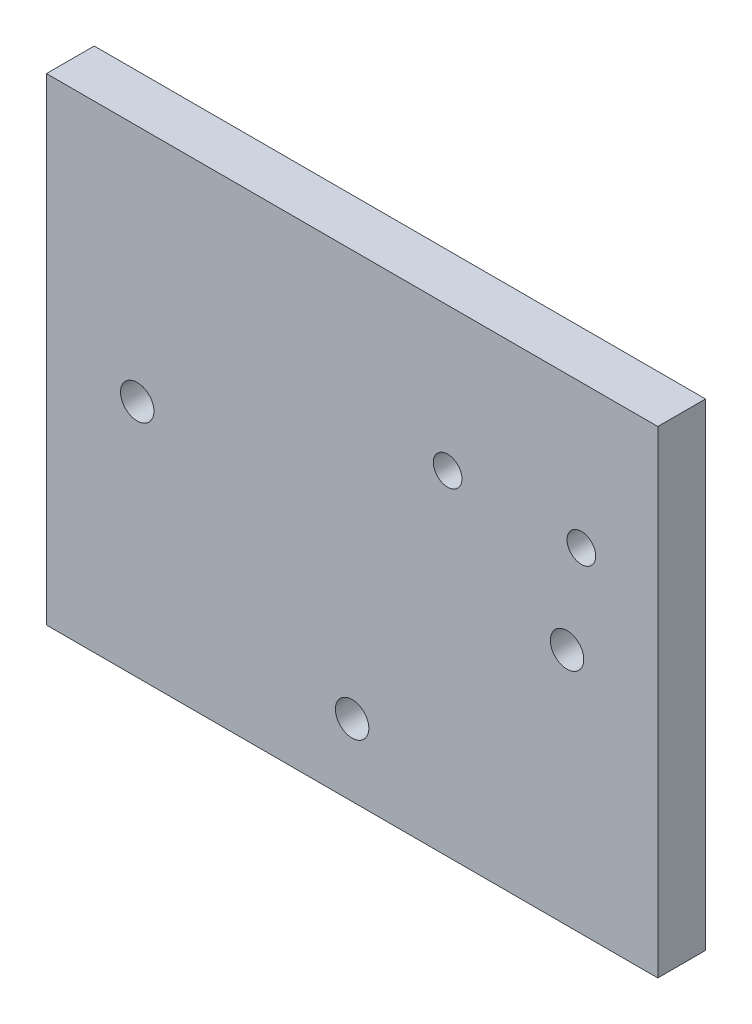
ISO-10303-21;
HEADER;
FILE_DESCRIPTION(('STEP AP214'),'2;1');
FILE_NAME('part.step','',(''),(''),'','','');
FILE_SCHEMA(('AUTOMOTIVE_DESIGN { 1 0 10303 214 1 1 1 1 }'));
ENDSEC;
DATA;
#1=APPLICATION_CONTEXT('core data for automotive mechanical design processes');
#2=APPLICATION_PROTOCOL_DEFINITION('international standard','automotive_design',2000,#1);
#3=PRODUCT_CONTEXT('',#1,'mechanical');
#4=PRODUCT('Part','Part','',(#3));
#5=PRODUCT_RELATED_PRODUCT_CATEGORY('part','',(#4));
#6=PRODUCT_DEFINITION_FORMATION('','',#4);
#7=PRODUCT_DEFINITION_CONTEXT('part definition',#1,'design');
#8=PRODUCT_DEFINITION('design','',#6,#7);
#9=PRODUCT_DEFINITION_SHAPE('','',#8);
#10=(LENGTH_UNIT() NAMED_UNIT(*) SI_UNIT(.MILLI.,.METRE.));
#11=(NAMED_UNIT(*) PLANE_ANGLE_UNIT() SI_UNIT($,.RADIAN.));
#12=(NAMED_UNIT(*) SI_UNIT($,.STERADIAN.) SOLID_ANGLE_UNIT());
#13=UNCERTAINTY_MEASURE_WITH_UNIT(LENGTH_MEASURE(1.E-05),#10,'distance_accuracy_value','');
#14=(GEOMETRIC_REPRESENTATION_CONTEXT(3) GLOBAL_UNCERTAINTY_ASSIGNED_CONTEXT((#13)) GLOBAL_UNIT_ASSIGNED_CONTEXT((#10,
#11,#12)) REPRESENTATION_CONTEXT('',''));
#15=CARTESIAN_POINT('',(0.,0.,0.));
#16=DIRECTION('',(0.,0.,1.));
#17=DIRECTION('',(1.,0.,0.));
#18=AXIS2_PLACEMENT_3D('',#15,#16,#17);
#19=CARTESIAN_POINT('',(0.,0.,5.));
#20=DIRECTION('',(0.,0.,-1.));
#21=DIRECTION('',(-1.,0.,0.));
#22=AXIS2_PLACEMENT_3D('',#19,#20,#21);
#23=PLANE('',#22);
#24=DIRECTION('',(0.,1.,0.));
#25=VECTOR('',#24,1.);
#26=CARTESIAN_POINT('',(32.,-25.,5.));
#27=LINE('',#26,#25);
#28=CARTESIAN_POINT('',(32.,-25.,5.));
#29=VERTEX_POINT('',#28);
#30=CARTESIAN_POINT('',(32.,25.,5.));
#31=VERTEX_POINT('',#30);
#32=EDGE_CURVE('E91',#29,#31,#27,.T.);
#33=ORIENTED_EDGE('',*,*,#32,.T.);
#34=DIRECTION('',(-1.,0.,0.));
#35=VECTOR('',#34,1.);
#36=CARTESIAN_POINT('',(-32.,25.,5.));
#37=LINE('',#36,#35);
#38=CARTESIAN_POINT('',(-32.,25.,5.));
#39=VERTEX_POINT('',#38);
#40=EDGE_CURVE('E86',#31,#39,#37,.T.);
#41=ORIENTED_EDGE('',*,*,#40,.T.);
#42=DIRECTION('',(0.,-1.,0.));
#43=VECTOR('',#42,1.);
#44=CARTESIAN_POINT('',(-32.,-25.,5.));
#45=LINE('',#44,#43);
#46=CARTESIAN_POINT('',(-32.,-25.,5.));
#47=VERTEX_POINT('',#46);
#48=EDGE_CURVE('E89',#39,#47,#45,.T.);
#49=ORIENTED_EDGE('',*,*,#48,.T.);
#50=DIRECTION('',(1.,0.,0.));
#51=VECTOR('',#50,1.);
#52=CARTESIAN_POINT('',(-32.,-25.,5.));
#53=LINE('',#52,#51);
#54=EDGE_CURVE('E56',#47,#29,#53,.T.);
#55=ORIENTED_EDGE('',*,*,#54,.T.);
#56=EDGE_LOOP('',(#33,#41,#49,#55));
#57=FACE_BOUND('',#56,.T.);
#58=CARTESIAN_POINT('',(-22.5,0.,5.));
#59=DIRECTION('',(0.,0.,1.));
#60=DIRECTION('',(1.,0.,0.));
#61=AXIS2_PLACEMENT_3D('',#58,#59,#60);
#62=CIRCLE('',#61,1.75);
#63=CARTESIAN_POINT('',(-20.75,0.,5.));
#64=VERTEX_POINT('',#63);
#65=EDGE_CURVE('E106',#64,#64,#62,.T.);
#66=ORIENTED_EDGE('',*,*,#65,.F.);
#67=EDGE_LOOP('',(#66));
#68=FACE_BOUND('',#67,.T.);
#69=CARTESIAN_POINT('',(22.5,0.,5.));
#70=DIRECTION('',(0.,0.,1.));
#71=DIRECTION('',(1.,0.,0.));
#72=AXIS2_PLACEMENT_3D('',#69,#70,#71);
#73=CIRCLE('',#72,1.75);
#74=CARTESIAN_POINT('',(24.25,0.,5.));
#75=VERTEX_POINT('',#74);
#76=EDGE_CURVE('E121',#75,#75,#73,.T.);
#77=ORIENTED_EDGE('',*,*,#76,.F.);
#78=EDGE_LOOP('',(#77));
#79=FACE_BOUND('',#78,.T.);
#80=CARTESIAN_POINT('',(0.,-17.5,5.));
#81=DIRECTION('',(0.,0.,1.));
#82=DIRECTION('',(1.,0.,0.));
#83=AXIS2_PLACEMENT_3D('',#80,#81,#82);
#84=CIRCLE('',#83,1.75);
#85=CARTESIAN_POINT('',(1.75,-17.5,5.));
#86=VERTEX_POINT('',#85);
#87=EDGE_CURVE('E127',#86,#86,#84,.T.);
#88=ORIENTED_EDGE('',*,*,#87,.F.);
#89=EDGE_LOOP('',(#88));
#90=FACE_BOUND('',#89,.T.);
#91=CARTESIAN_POINT('',(9.99999999999999,10.,5.));
#92=DIRECTION('',(0.,0.,1.));
#93=DIRECTION('',(1.,0.,0.));
#94=AXIS2_PLACEMENT_3D('',#91,#92,#93);
#95=CIRCLE('',#94,1.5);
#96=CARTESIAN_POINT('',(11.5,10.,5.));
#97=VERTEX_POINT('',#96);
#98=EDGE_CURVE('E133',#97,#97,#95,.T.);
#99=ORIENTED_EDGE('',*,*,#98,.F.);
#100=EDGE_LOOP('',(#99));
#101=FACE_BOUND('',#100,.T.);
#102=CARTESIAN_POINT('',(24.,10.,5.));
#103=DIRECTION('',(0.,0.,1.));
#104=DIRECTION('',(1.,0.,0.));
#105=AXIS2_PLACEMENT_3D('',#102,#103,#104);
#106=CIRCLE('',#105,1.5);
#107=CARTESIAN_POINT('',(25.5,10.,5.));
#108=VERTEX_POINT('',#107);
#109=EDGE_CURVE('E139',#108,#108,#106,.T.);
#110=ORIENTED_EDGE('',*,*,#109,.F.);
#111=EDGE_LOOP('',(#110));
#112=FACE_BOUND('',#111,.T.);
#113=ADVANCED_FACE('F39',(#57,#68,#79,#90,#101,#112),#23,.F.);
#114=CARTESIAN_POINT('',(0.,0.,0.));
#115=DIRECTION('',(0.,0.,-1.));
#116=DIRECTION('',(-1.,0.,0.));
#117=AXIS2_PLACEMENT_3D('',#114,#115,#116);
#118=PLANE('',#117);
#119=CARTESIAN_POINT('',(9.99999999999999,10.,0.));
#120=DIRECTION('',(0.,0.,1.));
#121=DIRECTION('',(1.,0.,0.));
#122=AXIS2_PLACEMENT_3D('',#119,#120,#121);
#123=CIRCLE('',#122,1.5);
#124=CARTESIAN_POINT('',(11.5,10.,0.));
#125=VERTEX_POINT('',#124);
#126=EDGE_CURVE('E136',#125,#125,#123,.T.);
#127=ORIENTED_EDGE('',*,*,#126,.T.);
#128=EDGE_LOOP('',(#127));
#129=FACE_BOUND('',#128,.T.);
#130=CARTESIAN_POINT('',(22.5,0.,0.));
#131=DIRECTION('',(0.,0.,1.));
#132=DIRECTION('',(1.,0.,0.));
#133=AXIS2_PLACEMENT_3D('',#130,#131,#132);
#134=CIRCLE('',#133,1.75);
#135=CARTESIAN_POINT('',(24.25,0.,0.));
#136=VERTEX_POINT('',#135);
#137=EDGE_CURVE('E124',#136,#136,#134,.T.);
#138=ORIENTED_EDGE('',*,*,#137,.T.);
#139=EDGE_LOOP('',(#138));
#140=FACE_BOUND('',#139,.T.);
#141=DIRECTION('',(0.,1.,0.));
#142=VECTOR('',#141,1.);
#143=CARTESIAN_POINT('',(32.,-25.,0.));
#144=LINE('',#143,#142);
#145=CARTESIAN_POINT('',(32.,-25.,0.));
#146=VERTEX_POINT('',#145);
#147=CARTESIAN_POINT('',(32.,25.,0.));
#148=VERTEX_POINT('',#147);
#149=EDGE_CURVE('E103',#146,#148,#144,.T.);
#150=ORIENTED_EDGE('',*,*,#149,.F.);
#151=DIRECTION('',(1.,0.,0.));
#152=VECTOR('',#151,1.);
#153=CARTESIAN_POINT('',(-32.,-25.,0.));
#154=LINE('',#153,#152);
#155=CARTESIAN_POINT('',(-32.,-25.,0.));
#156=VERTEX_POINT('',#155);
#157=EDGE_CURVE('E79',#156,#146,#154,.T.);
#158=ORIENTED_EDGE('',*,*,#157,.F.);
#159=DIRECTION('',(0.,-1.,0.));
#160=VECTOR('',#159,1.);
#161=CARTESIAN_POINT('',(-32.,-25.,0.));
#162=LINE('',#161,#160);
#163=CARTESIAN_POINT('',(-32.,25.,0.));
#164=VERTEX_POINT('',#163);
#165=EDGE_CURVE('E73',#164,#156,#162,.T.);
#166=ORIENTED_EDGE('',*,*,#165,.F.);
#167=DIRECTION('',(-1.,0.,0.));
#168=VECTOR('',#167,1.);
#169=CARTESIAN_POINT('',(-32.,25.,0.));
#170=LINE('',#169,#168);
#171=EDGE_CURVE('E95',#148,#164,#170,.T.);
#172=ORIENTED_EDGE('',*,*,#171,.F.);
#173=EDGE_LOOP('',(#150,#158,#166,#172));
#174=FACE_BOUND('',#173,.T.);
#175=CARTESIAN_POINT('',(-22.5,0.,0.));
#176=DIRECTION('',(0.,0.,1.));
#177=DIRECTION('',(1.,0.,0.));
#178=AXIS2_PLACEMENT_3D('',#175,#176,#177);
#179=CIRCLE('',#178,1.75);
#180=CARTESIAN_POINT('',(-20.75,0.,0.));
#181=VERTEX_POINT('',#180);
#182=EDGE_CURVE('E118',#181,#181,#179,.T.);
#183=ORIENTED_EDGE('',*,*,#182,.T.);
#184=EDGE_LOOP('',(#183));
#185=FACE_BOUND('',#184,.T.);
#186=CARTESIAN_POINT('',(0.,-17.5,0.));
#187=DIRECTION('',(0.,0.,1.));
#188=DIRECTION('',(1.,0.,0.));
#189=AXIS2_PLACEMENT_3D('',#186,#187,#188);
#190=CIRCLE('',#189,1.75);
#191=CARTESIAN_POINT('',(1.75,-17.5,0.));
#192=VERTEX_POINT('',#191);
#193=EDGE_CURVE('E130',#192,#192,#190,.T.);
#194=ORIENTED_EDGE('',*,*,#193,.T.);
#195=EDGE_LOOP('',(#194));
#196=FACE_BOUND('',#195,.T.);
#197=CARTESIAN_POINT('',(24.,10.,0.));
#198=DIRECTION('',(0.,0.,1.));
#199=DIRECTION('',(1.,0.,0.));
#200=AXIS2_PLACEMENT_3D('',#197,#198,#199);
#201=CIRCLE('',#200,1.5);
#202=CARTESIAN_POINT('',(25.5,10.,0.));
#203=VERTEX_POINT('',#202);
#204=EDGE_CURVE('E142',#203,#203,#201,.T.);
#205=ORIENTED_EDGE('',*,*,#204,.T.);
#206=EDGE_LOOP('',(#205));
#207=FACE_BOUND('',#206,.T.);
#208=ADVANCED_FACE('F114',(#129,#140,#174,#185,#196,#207),#118,.T.);
#209=CARTESIAN_POINT('',(32.,-25.,5.));
#210=DIRECTION('',(-1.,0.,0.));
#211=DIRECTION('',(0.,0.,1.));
#212=AXIS2_PLACEMENT_3D('',#209,#210,#211);
#213=PLANE('',#212);
#214=ORIENTED_EDGE('',*,*,#149,.T.);
#215=DIRECTION('',(0.,0.,-1.));
#216=VECTOR('',#215,1.);
#217=CARTESIAN_POINT('',(32.,25.,5.));
#218=LINE('',#217,#216);
#219=EDGE_CURVE('E11',#31,#148,#218,.T.);
#220=ORIENTED_EDGE('',*,*,#219,.F.);
#221=ORIENTED_EDGE('',*,*,#32,.F.);
#222=DIRECTION('',(0.,0.,-1.));
#223=VECTOR('',#222,1.);
#224=CARTESIAN_POINT('',(32.,-25.,5.));
#225=LINE('',#224,#223);
#226=EDGE_CURVE('E99',#29,#146,#225,.T.);
#227=ORIENTED_EDGE('',*,*,#226,.T.);
#228=EDGE_LOOP('',(#214,#220,#221,#227));
#229=FACE_BOUND('',#228,.T.);
#230=ADVANCED_FACE('F41',(#229),#213,.F.);
#231=CARTESIAN_POINT('',(-32.,25.,5.));
#232=DIRECTION('',(0.,-1.,0.));
#233=DIRECTION('',(0.,0.,-1.));
#234=AXIS2_PLACEMENT_3D('',#231,#232,#233);
#235=PLANE('',#234);
#236=ORIENTED_EDGE('',*,*,#171,.T.);
#237=DIRECTION('',(0.,0.,-1.));
#238=VECTOR('',#237,1.);
#239=CARTESIAN_POINT('',(-32.,25.,5.));
#240=LINE('',#239,#238);
#241=EDGE_CURVE('E48',#39,#164,#240,.T.);
#242=ORIENTED_EDGE('',*,*,#241,.F.);
#243=ORIENTED_EDGE('',*,*,#40,.F.);
#244=ORIENTED_EDGE('',*,*,#219,.T.);
#245=EDGE_LOOP('',(#236,#242,#243,#244));
#246=FACE_BOUND('',#245,.T.);
#247=ADVANCED_FACE('F94',(#246),#235,.F.);
#248=CARTESIAN_POINT('',(-32.,-25.,5.));
#249=DIRECTION('',(1.,0.,0.));
#250=DIRECTION('',(0.,0.,-1.));
#251=AXIS2_PLACEMENT_3D('',#248,#249,#250);
#252=PLANE('',#251);
#253=ORIENTED_EDGE('',*,*,#165,.T.);
#254=DIRECTION('',(0.,0.,-1.));
#255=VECTOR('',#254,1.);
#256=CARTESIAN_POINT('',(-32.,-25.,5.));
#257=LINE('',#256,#255);
#258=EDGE_CURVE('E96',#47,#156,#257,.T.);
#259=ORIENTED_EDGE('',*,*,#258,.F.);
#260=ORIENTED_EDGE('',*,*,#48,.F.);
#261=ORIENTED_EDGE('',*,*,#241,.T.);
#262=EDGE_LOOP('',(#253,#259,#260,#261));
#263=FACE_BOUND('',#262,.T.);
#264=ADVANCED_FACE('F97',(#263),#252,.F.);
#265=CARTESIAN_POINT('',(-32.,-25.,5.));
#266=DIRECTION('',(0.,1.,0.));
#267=DIRECTION('',(0.,0.,1.));
#268=AXIS2_PLACEMENT_3D('',#265,#266,#267);
#269=PLANE('',#268);
#270=ORIENTED_EDGE('',*,*,#157,.T.);
#271=ORIENTED_EDGE('',*,*,#226,.F.);
#272=ORIENTED_EDGE('',*,*,#54,.F.);
#273=ORIENTED_EDGE('',*,*,#258,.T.);
#274=EDGE_LOOP('',(#270,#271,#272,#273));
#275=FACE_BOUND('',#274,.T.);
#276=ADVANCED_FACE('F111',(#275),#269,.F.);
#277=CARTESIAN_POINT('',(-22.5,0.,5.));
#278=DIRECTION('',(0.,0.,-1.));
#279=DIRECTION('',(-1.,0.,0.));
#280=AXIS2_PLACEMENT_3D('',#277,#278,#279);
#281=CYLINDRICAL_SURFACE('',#280,1.75);
#282=ORIENTED_EDGE('',*,*,#65,.T.);
#283=EDGE_LOOP('',(#282));
#284=FACE_BOUND('',#283,.T.);
#285=ORIENTED_EDGE('',*,*,#182,.F.);
#286=EDGE_LOOP('',(#285));
#287=FACE_BOUND('',#286,.T.);
#288=ADVANCED_FACE('F159',(#284,#287),#281,.F.);
#289=CARTESIAN_POINT('',(22.5,0.,5.));
#290=DIRECTION('',(0.,0.,-1.));
#291=DIRECTION('',(-1.,0.,0.));
#292=AXIS2_PLACEMENT_3D('',#289,#290,#291);
#293=CYLINDRICAL_SURFACE('',#292,1.75);
#294=ORIENTED_EDGE('',*,*,#76,.T.);
#295=EDGE_LOOP('',(#294));
#296=FACE_BOUND('',#295,.T.);
#297=ORIENTED_EDGE('',*,*,#137,.F.);
#298=EDGE_LOOP('',(#297));
#299=FACE_BOUND('',#298,.T.);
#300=ADVANCED_FACE('F205',(#296,#299),#293,.F.);
#301=CARTESIAN_POINT('',(0.,-17.5,5.));
#302=DIRECTION('',(0.,0.,-1.));
#303=DIRECTION('',(-1.,0.,0.));
#304=AXIS2_PLACEMENT_3D('',#301,#302,#303);
#305=CYLINDRICAL_SURFACE('',#304,1.75);
#306=ORIENTED_EDGE('',*,*,#87,.T.);
#307=EDGE_LOOP('',(#306));
#308=FACE_BOUND('',#307,.T.);
#309=ORIENTED_EDGE('',*,*,#193,.F.);
#310=EDGE_LOOP('',(#309));
#311=FACE_BOUND('',#310,.T.);
#312=ADVANCED_FACE('F213',(#308,#311),#305,.F.);
#313=CARTESIAN_POINT('',(9.99999999999999,10.,5.));
#314=DIRECTION('',(0.,0.,-1.));
#315=DIRECTION('',(-1.,0.,0.));
#316=AXIS2_PLACEMENT_3D('',#313,#314,#315);
#317=CYLINDRICAL_SURFACE('',#316,1.5);
#318=ORIENTED_EDGE('',*,*,#98,.T.);
#319=EDGE_LOOP('',(#318));
#320=FACE_BOUND('',#319,.T.);
#321=ORIENTED_EDGE('',*,*,#126,.F.);
#322=EDGE_LOOP('',(#321));
#323=FACE_BOUND('',#322,.T.);
#324=ADVANCED_FACE('F221',(#320,#323),#317,.F.);
#325=CARTESIAN_POINT('',(24.,10.,5.));
#326=DIRECTION('',(0.,0.,-1.));
#327=DIRECTION('',(-1.,0.,0.));
#328=AXIS2_PLACEMENT_3D('',#325,#326,#327);
#329=CYLINDRICAL_SURFACE('',#328,1.5);
#330=ORIENTED_EDGE('',*,*,#109,.T.);
#331=EDGE_LOOP('',(#330));
#332=FACE_BOUND('',#331,.T.);
#333=ORIENTED_EDGE('',*,*,#204,.F.);
#334=EDGE_LOOP('',(#333));
#335=FACE_BOUND('',#334,.T.);
#336=ADVANCED_FACE('F148',(#332,#335),#329,.F.);
#337=CLOSED_SHELL('',(#113,#208,#230,#247,#264,#276,#288,#300,#312,#324,#336));
#338=MANIFOLD_SOLID_BREP('B2',#337);
#339=ADVANCED_BREP_SHAPE_REPRESENTATION('',(#18,#338),#14);
#340=SHAPE_DEFINITION_REPRESENTATION(#9,#339);
ENDSEC;
END-ISO-10303-21;
